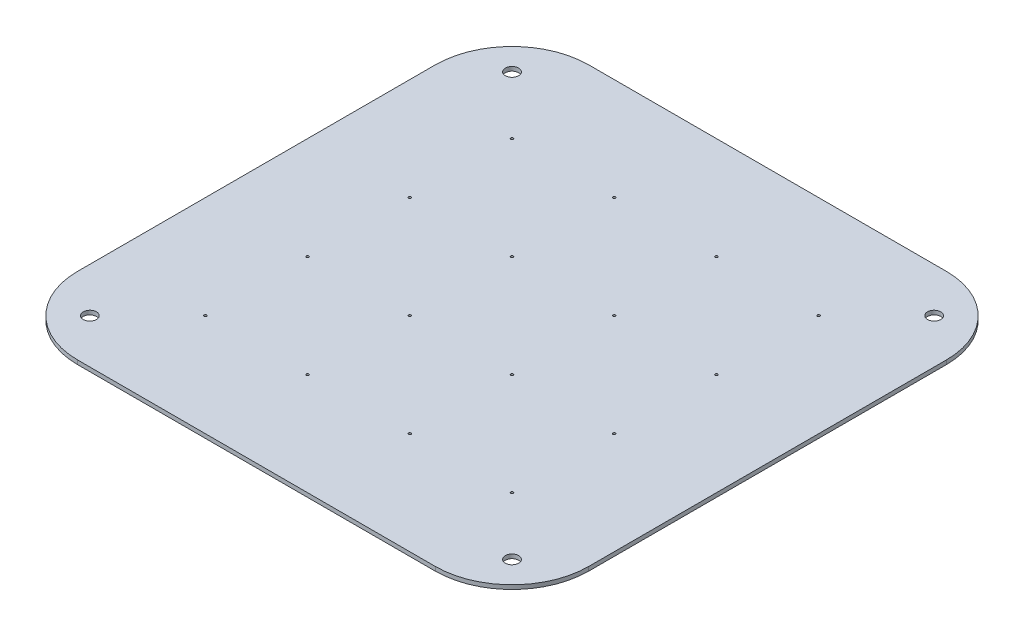
ISO-10303-21;
HEADER;
FILE_DESCRIPTION(('STEP AP214'),'2;1');
FILE_NAME('part.step','',(''),(''),'','','');
FILE_SCHEMA(('AUTOMOTIVE_DESIGN { 1 0 10303 214 1 1 1 1 }'));
ENDSEC;
DATA;
#1=APPLICATION_CONTEXT('core data for automotive mechanical design processes');
#2=APPLICATION_PROTOCOL_DEFINITION('international standard','automotive_design',2000,#1);
#3=PRODUCT_CONTEXT('',#1,'mechanical');
#4=PRODUCT('Part','Part','',(#3));
#5=PRODUCT_RELATED_PRODUCT_CATEGORY('part','',(#4));
#6=PRODUCT_DEFINITION_FORMATION('','',#4);
#7=PRODUCT_DEFINITION_CONTEXT('part definition',#1,'design');
#8=PRODUCT_DEFINITION('design','',#6,#7);
#9=PRODUCT_DEFINITION_SHAPE('','',#8);
#10=(LENGTH_UNIT() NAMED_UNIT(*) SI_UNIT(.MILLI.,.METRE.));
#11=(NAMED_UNIT(*) PLANE_ANGLE_UNIT() SI_UNIT($,.RADIAN.));
#12=(NAMED_UNIT(*) SI_UNIT($,.STERADIAN.) SOLID_ANGLE_UNIT());
#13=UNCERTAINTY_MEASURE_WITH_UNIT(LENGTH_MEASURE(1.E-05),#10,'distance_accuracy_value','');
#14=(GEOMETRIC_REPRESENTATION_CONTEXT(3) GLOBAL_UNCERTAINTY_ASSIGNED_CONTEXT((#13)) GLOBAL_UNIT_ASSIGNED_CONTEXT((#10,
#11,#12)) REPRESENTATION_CONTEXT('',''));
#15=CARTESIAN_POINT('',(0.,0.,0.));
#16=DIRECTION('',(0.,0.,1.));
#17=DIRECTION('',(1.,0.,0.));
#18=AXIS2_PLACEMENT_3D('',#15,#16,#17);
#19=CARTESIAN_POINT('',(0.,1.6,-100.));
#20=DIRECTION('',(0.,0.,1.));
#21=DIRECTION('',(1.,0.,0.));
#22=AXIS2_PLACEMENT_3D('',#19,#20,#21);
#23=PLANE('',#22);
#24=DIRECTION('',(-1.,0.,0.));
#25=VECTOR('',#24,1.);
#26=CARTESIAN_POINT('',(0.,0.,-100.));
#27=LINE('',#26,#25);
#28=CARTESIAN_POINT('',(70.,0.,-100.));
#29=VERTEX_POINT('',#28);
#30=CARTESIAN_POINT('',(-70.,0.,-100.));
#31=VERTEX_POINT('',#30);
#32=EDGE_CURVE('E195',#29,#31,#27,.T.);
#33=ORIENTED_EDGE('',*,*,#32,.T.);
#34=DIRECTION('',(0.,-1.,0.));
#35=VECTOR('',#34,1.);
#36=CARTESIAN_POINT('',(-70.,1.6,-100.));
#37=LINE('',#36,#35);
#38=CARTESIAN_POINT('',(-70.,1.6,-100.));
#39=VERTEX_POINT('',#38);
#40=EDGE_CURVE('E11',#39,#31,#37,.T.);
#41=ORIENTED_EDGE('',*,*,#40,.F.);
#42=DIRECTION('',(-1.,0.,0.));
#43=VECTOR('',#42,1.);
#44=CARTESIAN_POINT('',(0.,1.6,-100.));
#45=LINE('',#44,#43);
#46=CARTESIAN_POINT('',(70.,1.6,-100.));
#47=VERTEX_POINT('',#46);
#48=EDGE_CURVE('E288',#47,#39,#45,.T.);
#49=ORIENTED_EDGE('',*,*,#48,.F.);
#50=DIRECTION('',(0.,-1.,0.));
#51=VECTOR('',#50,1.);
#52=CARTESIAN_POINT('',(70.,1.6,-100.));
#53=LINE('',#52,#51);
#54=EDGE_CURVE('E182',#47,#29,#53,.T.);
#55=ORIENTED_EDGE('',*,*,#54,.T.);
#56=EDGE_LOOP('',(#33,#41,#49,#55));
#57=FACE_BOUND('',#56,.T.);
#58=ADVANCED_FACE('F37',(#57),#23,.F.);
#59=CARTESIAN_POINT('',(-70.,1.6,-70.));
#60=DIRECTION('',(0.,-1.,0.));
#61=DIRECTION('',(0.,0.,-1.));
#62=AXIS2_PLACEMENT_3D('',#59,#60,#61);
#63=CYLINDRICAL_SURFACE('',#62,30.);
#64=CARTESIAN_POINT('',(-70.,0.,-70.));
#65=DIRECTION('',(0.,1.,0.));
#66=DIRECTION('',(0.,0.,1.));
#67=AXIS2_PLACEMENT_3D('',#64,#65,#66);
#68=CIRCLE('',#67,30.);
#69=CARTESIAN_POINT('',(-100.,0.,-70.));
#70=VERTEX_POINT('',#69);
#71=EDGE_CURVE('E198',#31,#70,#68,.T.);
#72=ORIENTED_EDGE('',*,*,#71,.T.);
#73=DIRECTION('',(0.,-1.,0.));
#74=VECTOR('',#73,1.);
#75=CARTESIAN_POINT('',(-100.,1.6,-70.));
#76=LINE('',#75,#74);
#77=CARTESIAN_POINT('',(-100.,1.6,-70.));
#78=VERTEX_POINT('',#77);
#79=EDGE_CURVE('E46',#78,#70,#76,.T.);
#80=ORIENTED_EDGE('',*,*,#79,.F.);
#81=CARTESIAN_POINT('',(-70.,1.6,-70.));
#82=DIRECTION('',(0.,1.,0.));
#83=DIRECTION('',(0.,0.,1.));
#84=AXIS2_PLACEMENT_3D('',#81,#82,#83);
#85=CIRCLE('',#84,30.);
#86=EDGE_CURVE('E97',#39,#78,#85,.T.);
#87=ORIENTED_EDGE('',*,*,#86,.F.);
#88=ORIENTED_EDGE('',*,*,#40,.T.);
#89=EDGE_LOOP('',(#72,#80,#87,#88));
#90=FACE_BOUND('',#89,.T.);
#91=ADVANCED_FACE('F274',(#90),#63,.T.);
#92=CARTESIAN_POINT('',(-100.,1.6,0.));
#93=DIRECTION('',(-1.,0.,0.));
#94=DIRECTION('',(0.,0.,1.));
#95=AXIS2_PLACEMENT_3D('',#92,#93,#94);
#96=PLANE('',#95);
#97=DIRECTION('',(0.,0.,-1.));
#98=VECTOR('',#97,1.);
#99=CARTESIAN_POINT('',(-100.,0.,0.));
#100=LINE('',#99,#98);
#101=CARTESIAN_POINT('',(-100.,0.,70.));
#102=VERTEX_POINT('',#101);
#103=EDGE_CURVE('E201',#102,#70,#100,.T.);
#104=ORIENTED_EDGE('',*,*,#103,.F.);
#105=DIRECTION('',(0.,-1.,0.));
#106=VECTOR('',#105,1.);
#107=CARTESIAN_POINT('',(-100.,1.6,70.));
#108=LINE('',#107,#106);
#109=CARTESIAN_POINT('',(-100.,1.6,70.));
#110=VERTEX_POINT('',#109);
#111=EDGE_CURVE('E267',#110,#102,#108,.T.);
#112=ORIENTED_EDGE('',*,*,#111,.F.);
#113=DIRECTION('',(0.,0.,-1.));
#114=VECTOR('',#113,1.);
#115=CARTESIAN_POINT('',(-100.,1.6,0.));
#116=LINE('',#115,#114);
#117=EDGE_CURVE('E273',#110,#78,#116,.T.);
#118=ORIENTED_EDGE('',*,*,#117,.T.);
#119=ORIENTED_EDGE('',*,*,#79,.T.);
#120=EDGE_LOOP('',(#104,#112,#118,#119));
#121=FACE_BOUND('',#120,.T.);
#122=ADVANCED_FACE('F271',(#121),#96,.T.);
#123=CARTESIAN_POINT('',(-70.,1.6,70.));
#124=DIRECTION('',(0.,-1.,0.));
#125=DIRECTION('',(0.,0.,-1.));
#126=AXIS2_PLACEMENT_3D('',#123,#124,#125);
#127=CYLINDRICAL_SURFACE('',#126,30.);
#128=CARTESIAN_POINT('',(-70.,0.,70.));
#129=DIRECTION('',(0.,1.,0.));
#130=DIRECTION('',(0.,0.,1.));
#131=AXIS2_PLACEMENT_3D('',#128,#129,#130);
#132=CIRCLE('',#131,30.);
#133=CARTESIAN_POINT('',(-70.,0.,100.));
#134=VERTEX_POINT('',#133);
#135=EDGE_CURVE('E204',#134,#102,#132,.F.);
#136=ORIENTED_EDGE('',*,*,#135,.F.);
#137=DIRECTION('',(0.,-1.,0.));
#138=VECTOR('',#137,1.);
#139=CARTESIAN_POINT('',(-70.,1.6,100.));
#140=LINE('',#139,#138);
#141=CARTESIAN_POINT('',(-70.,1.6,100.));
#142=VERTEX_POINT('',#141);
#143=EDGE_CURVE('E265',#142,#134,#140,.T.);
#144=ORIENTED_EDGE('',*,*,#143,.F.);
#145=CARTESIAN_POINT('',(-70.,1.6,70.));
#146=DIRECTION('',(0.,1.,0.));
#147=DIRECTION('',(0.,0.,1.));
#148=AXIS2_PLACEMENT_3D('',#145,#146,#147);
#149=CIRCLE('',#148,30.);
#150=EDGE_CURVE('E285',#142,#110,#149,.F.);
#151=ORIENTED_EDGE('',*,*,#150,.T.);
#152=ORIENTED_EDGE('',*,*,#111,.T.);
#153=EDGE_LOOP('',(#136,#144,#151,#152));
#154=FACE_BOUND('',#153,.T.);
#155=ADVANCED_FACE('F283',(#154),#127,.T.);
#156=CARTESIAN_POINT('',(0.,1.6,100.));
#157=DIRECTION('',(0.,0.,1.));
#158=DIRECTION('',(1.,0.,0.));
#159=AXIS2_PLACEMENT_3D('',#156,#157,#158);
#160=PLANE('',#159);
#161=DIRECTION('',(-1.,0.,0.));
#162=VECTOR('',#161,1.);
#163=CARTESIAN_POINT('',(0.,0.,100.));
#164=LINE('',#163,#162);
#165=CARTESIAN_POINT('',(70.,0.,100.));
#166=VERTEX_POINT('',#165);
#167=EDGE_CURVE('E207',#166,#134,#164,.T.);
#168=ORIENTED_EDGE('',*,*,#167,.F.);
#169=DIRECTION('',(0.,-1.,0.));
#170=VECTOR('',#169,1.);
#171=CARTESIAN_POINT('',(70.,1.6,100.));
#172=LINE('',#171,#170);
#173=CARTESIAN_POINT('',(70.,1.6,100.));
#174=VERTEX_POINT('',#173);
#175=EDGE_CURVE('E126',#174,#166,#172,.T.);
#176=ORIENTED_EDGE('',*,*,#175,.F.);
#177=DIRECTION('',(-1.,0.,0.));
#178=VECTOR('',#177,1.);
#179=CARTESIAN_POINT('',(0.,1.6,100.));
#180=LINE('',#179,#178);
#181=EDGE_CURVE('E119',#174,#142,#180,.T.);
#182=ORIENTED_EDGE('',*,*,#181,.T.);
#183=ORIENTED_EDGE('',*,*,#143,.T.);
#184=EDGE_LOOP('',(#168,#176,#182,#183));
#185=FACE_BOUND('',#184,.T.);
#186=ADVANCED_FACE('F292',(#185),#160,.T.);
#187=CARTESIAN_POINT('',(70.,1.6,70.));
#188=DIRECTION('',(0.,-1.,0.));
#189=DIRECTION('',(0.,0.,-1.));
#190=AXIS2_PLACEMENT_3D('',#187,#188,#189);
#191=CYLINDRICAL_SURFACE('',#190,30.);
#192=CARTESIAN_POINT('',(70.,0.,70.));
#193=DIRECTION('',(0.,1.,0.));
#194=DIRECTION('',(0.,0.,1.));
#195=AXIS2_PLACEMENT_3D('',#192,#193,#194);
#196=CIRCLE('',#195,30.);
#197=CARTESIAN_POINT('',(100.,0.,69.9999999999999));
#198=VERTEX_POINT('',#197);
#199=EDGE_CURVE('E125',#166,#198,#196,.T.);
#200=ORIENTED_EDGE('',*,*,#199,.T.);
#201=DIRECTION('',(0.,-1.,0.));
#202=VECTOR('',#201,1.);
#203=CARTESIAN_POINT('',(100.,1.6,69.9999999999999));
#204=LINE('',#203,#202);
#205=CARTESIAN_POINT('',(100.,1.6,69.9999999999999));
#206=VERTEX_POINT('',#205);
#207=EDGE_CURVE('E122',#206,#198,#204,.T.);
#208=ORIENTED_EDGE('',*,*,#207,.F.);
#209=CARTESIAN_POINT('',(70.,1.6,70.));
#210=DIRECTION('',(0.,1.,0.));
#211=DIRECTION('',(0.,0.,1.));
#212=AXIS2_PLACEMENT_3D('',#209,#210,#211);
#213=CIRCLE('',#212,30.);
#214=EDGE_CURVE('E111',#174,#206,#213,.T.);
#215=ORIENTED_EDGE('',*,*,#214,.F.);
#216=ORIENTED_EDGE('',*,*,#175,.T.);
#217=EDGE_LOOP('',(#200,#208,#215,#216));
#218=FACE_BOUND('',#217,.T.);
#219=ADVANCED_FACE('F123',(#218),#191,.T.);
#220=CARTESIAN_POINT('',(100.,1.6,0.));
#221=DIRECTION('',(-1.,0.,0.));
#222=DIRECTION('',(0.,0.,1.));
#223=AXIS2_PLACEMENT_3D('',#220,#221,#222);
#224=PLANE('',#223);
#225=DIRECTION('',(0.,0.,-1.));
#226=VECTOR('',#225,1.);
#227=CARTESIAN_POINT('',(100.,0.,0.));
#228=LINE('',#227,#226);
#229=CARTESIAN_POINT('',(100.,0.,-69.9999999999999));
#230=VERTEX_POINT('',#229);
#231=EDGE_CURVE('E83',#198,#230,#228,.T.);
#232=ORIENTED_EDGE('',*,*,#231,.T.);
#233=DIRECTION('',(0.,-1.,0.));
#234=VECTOR('',#233,1.);
#235=CARTESIAN_POINT('',(100.,1.6,-69.9999999999999));
#236=LINE('',#235,#234);
#237=CARTESIAN_POINT('',(100.,1.6,-69.9999999999999));
#238=VERTEX_POINT('',#237);
#239=EDGE_CURVE('E127',#238,#230,#236,.T.);
#240=ORIENTED_EDGE('',*,*,#239,.F.);
#241=DIRECTION('',(0.,0.,-1.));
#242=VECTOR('',#241,1.);
#243=CARTESIAN_POINT('',(100.,1.6,0.));
#244=LINE('',#243,#242);
#245=EDGE_CURVE('E116',#206,#238,#244,.T.);
#246=ORIENTED_EDGE('',*,*,#245,.F.);
#247=ORIENTED_EDGE('',*,*,#207,.T.);
#248=EDGE_LOOP('',(#232,#240,#246,#247));
#249=FACE_BOUND('',#248,.T.);
#250=ADVANCED_FACE('F129',(#249),#224,.F.);
#251=CARTESIAN_POINT('',(-19.9999999999999,1.6,19.9999999999999));
#252=DIRECTION('',(0.,-1.,0.));
#253=DIRECTION('',(0.,0.,-1.));
#254=AXIS2_PLACEMENT_3D('',#251,#252,#253);
#255=CYLINDRICAL_SURFACE('',#254,0.499999999999999);
#256=CARTESIAN_POINT('',(-19.9999999999999,1.6,19.9999999999999));
#257=DIRECTION('',(0.,1.,0.));
#258=DIRECTION('',(0.,0.,1.));
#259=AXIS2_PLACEMENT_3D('',#256,#257,#258);
#260=CIRCLE('',#259,0.499999999999999);
#261=CARTESIAN_POINT('',(-19.9999999999999,1.6,20.4999999999999));
#262=VERTEX_POINT('',#261);
#263=EDGE_CURVE('E176',#262,#262,#260,.T.);
#264=ORIENTED_EDGE('',*,*,#263,.T.);
#265=EDGE_LOOP('',(#264));
#266=FACE_BOUND('',#265,.T.);
#267=CARTESIAN_POINT('',(-19.9999999999999,0.,19.9999999999999));
#268=DIRECTION('',(0.,1.,0.));
#269=DIRECTION('',(0.,0.,1.));
#270=AXIS2_PLACEMENT_3D('',#267,#268,#269);
#271=CIRCLE('',#270,0.499999999999999);
#272=CARTESIAN_POINT('',(-19.9999999999999,0.,20.4999999999999));
#273=VERTEX_POINT('',#272);
#274=EDGE_CURVE('E255',#273,#273,#271,.T.);
#275=ORIENTED_EDGE('',*,*,#274,.F.);
#276=EDGE_LOOP('',(#275));
#277=FACE_BOUND('',#276,.T.);
#278=ADVANCED_FACE('F353',(#266,#277),#255,.F.);
#279=CARTESIAN_POINT('',(60.,1.6,19.9999999999999));
#280=DIRECTION('',(0.,-1.,0.));
#281=DIRECTION('',(0.,0.,-1.));
#282=AXIS2_PLACEMENT_3D('',#279,#280,#281);
#283=CYLINDRICAL_SURFACE('',#282,0.499999999999999);
#284=CARTESIAN_POINT('',(60.,1.6,19.9999999999999));
#285=DIRECTION('',(0.,1.,0.));
#286=DIRECTION('',(0.,0.,1.));
#287=AXIS2_PLACEMENT_3D('',#284,#285,#286);
#288=CIRCLE('',#287,0.499999999999999);
#289=CARTESIAN_POINT('',(60.,1.6,20.4999999999999));
#290=VERTEX_POINT('',#289);
#291=EDGE_CURVE('E173',#290,#290,#288,.F.);
#292=ORIENTED_EDGE('',*,*,#291,.F.);
#293=EDGE_LOOP('',(#292));
#294=FACE_BOUND('',#293,.T.);
#295=CARTESIAN_POINT('',(60.,0.,19.9999999999999));
#296=DIRECTION('',(0.,1.,0.));
#297=DIRECTION('',(0.,0.,1.));
#298=AXIS2_PLACEMENT_3D('',#295,#296,#297);
#299=CIRCLE('',#298,0.499999999999999);
#300=CARTESIAN_POINT('',(60.,0.,20.4999999999999));
#301=VERTEX_POINT('',#300);
#302=EDGE_CURVE('E252',#301,#301,#299,.F.);
#303=ORIENTED_EDGE('',*,*,#302,.T.);
#304=EDGE_LOOP('',(#303));
#305=FACE_BOUND('',#304,.T.);
#306=ADVANCED_FACE('F356',(#294,#305),#283,.F.);
#307=CARTESIAN_POINT('',(20.,1.6,59.9999999999999));
#308=DIRECTION('',(0.,-1.,0.));
#309=DIRECTION('',(0.,0.,-1.));
#310=AXIS2_PLACEMENT_3D('',#307,#308,#309);
#311=CYLINDRICAL_SURFACE('',#310,0.499999999999999);
#312=CARTESIAN_POINT('',(20.,1.6,59.9999999999999));
#313=DIRECTION('',(0.,1.,0.));
#314=DIRECTION('',(0.,0.,1.));
#315=AXIS2_PLACEMENT_3D('',#312,#313,#314);
#316=CIRCLE('',#315,0.499999999999999);
#317=CARTESIAN_POINT('',(20.,1.6,60.4999999999999));
#318=VERTEX_POINT('',#317);
#319=EDGE_CURVE('E170',#318,#318,#316,.T.);
#320=ORIENTED_EDGE('',*,*,#319,.T.);
#321=EDGE_LOOP('',(#320));
#322=FACE_BOUND('',#321,.T.);
#323=CARTESIAN_POINT('',(20.,0.,59.9999999999999));
#324=DIRECTION('',(0.,1.,0.));
#325=DIRECTION('',(0.,0.,1.));
#326=AXIS2_PLACEMENT_3D('',#323,#324,#325);
#327=CIRCLE('',#326,0.499999999999999);
#328=CARTESIAN_POINT('',(20.,0.,60.4999999999999));
#329=VERTEX_POINT('',#328);
#330=EDGE_CURVE('E249',#329,#329,#327,.T.);
#331=ORIENTED_EDGE('',*,*,#330,.F.);
#332=EDGE_LOOP('',(#331));
#333=FACE_BOUND('',#332,.T.);
#334=ADVANCED_FACE('F360',(#322,#333),#311,.F.);
#335=CARTESIAN_POINT('',(-60.,1.6,60.));
#336=DIRECTION('',(0.,-1.,0.));
#337=DIRECTION('',(0.,0.,-1.));
#338=AXIS2_PLACEMENT_3D('',#335,#336,#337);
#339=CYLINDRICAL_SURFACE('',#338,0.499999999999999);
#340=CARTESIAN_POINT('',(-60.,1.6,60.));
#341=DIRECTION('',(0.,1.,0.));
#342=DIRECTION('',(0.,0.,1.));
#343=AXIS2_PLACEMENT_3D('',#340,#341,#342);
#344=CIRCLE('',#343,0.499999999999999);
#345=CARTESIAN_POINT('',(-60.,1.6,60.5));
#346=VERTEX_POINT('',#345);
#347=EDGE_CURVE('E167',#346,#346,#344,.F.);
#348=ORIENTED_EDGE('',*,*,#347,.F.);
#349=EDGE_LOOP('',(#348));
#350=FACE_BOUND('',#349,.T.);
#351=CARTESIAN_POINT('',(-60.,0.,60.));
#352=DIRECTION('',(0.,1.,0.));
#353=DIRECTION('',(0.,0.,1.));
#354=AXIS2_PLACEMENT_3D('',#351,#352,#353);
#355=CIRCLE('',#354,0.499999999999999);
#356=CARTESIAN_POINT('',(-60.,0.,60.5));
#357=VERTEX_POINT('',#356);
#358=EDGE_CURVE('E246',#357,#357,#355,.F.);
#359=ORIENTED_EDGE('',*,*,#358,.T.);
#360=EDGE_LOOP('',(#359));
#361=FACE_BOUND('',#360,.T.);
#362=ADVANCED_FACE('F364',(#350,#361),#339,.F.);
#363=CARTESIAN_POINT('',(19.9999999999999,1.6,-19.9999999999999));
#364=DIRECTION('',(0.,-1.,0.));
#365=DIRECTION('',(0.,0.,-1.));
#366=AXIS2_PLACEMENT_3D('',#363,#364,#365);
#367=CYLINDRICAL_SURFACE('',#366,0.499999999999999);
#368=CARTESIAN_POINT('',(19.9999999999999,1.6,-19.9999999999999));
#369=DIRECTION('',(0.,1.,0.));
#370=DIRECTION('',(0.,0.,1.));
#371=AXIS2_PLACEMENT_3D('',#368,#369,#370);
#372=CIRCLE('',#371,0.499999999999999);
#373=CARTESIAN_POINT('',(19.9999999999999,1.6,-19.4999999999999));
#374=VERTEX_POINT('',#373);
#375=EDGE_CURVE('E164',#374,#374,#372,.T.);
#376=ORIENTED_EDGE('',*,*,#375,.T.);
#377=EDGE_LOOP('',(#376));
#378=FACE_BOUND('',#377,.T.);
#379=CARTESIAN_POINT('',(19.9999999999999,0.,-19.9999999999999));
#380=DIRECTION('',(0.,1.,0.));
#381=DIRECTION('',(0.,0.,1.));
#382=AXIS2_PLACEMENT_3D('',#379,#380,#381);
#383=CIRCLE('',#382,0.499999999999999);
#384=CARTESIAN_POINT('',(19.9999999999999,0.,-19.4999999999999));
#385=VERTEX_POINT('',#384);
#386=EDGE_CURVE('E243',#385,#385,#383,.T.);
#387=ORIENTED_EDGE('',*,*,#386,.F.);
#388=EDGE_LOOP('',(#387));
#389=FACE_BOUND('',#388,.T.);
#390=ADVANCED_FACE('F368',(#378,#389),#367,.F.);
#391=CARTESIAN_POINT('',(60.,1.6,-60.));
#392=DIRECTION('',(0.,-1.,0.));
#393=DIRECTION('',(0.,0.,-1.));
#394=AXIS2_PLACEMENT_3D('',#391,#392,#393);
#395=CYLINDRICAL_SURFACE('',#394,0.499999999999999);
#396=CARTESIAN_POINT('',(60.,1.6,-60.));
#397=DIRECTION('',(0.,1.,0.));
#398=DIRECTION('',(0.,0.,1.));
#399=AXIS2_PLACEMENT_3D('',#396,#397,#398);
#400=CIRCLE('',#399,0.499999999999999);
#401=CARTESIAN_POINT('',(60.,1.6,-59.5));
#402=VERTEX_POINT('',#401);
#403=EDGE_CURVE('E161',#402,#402,#400,.F.);
#404=ORIENTED_EDGE('',*,*,#403,.F.);
#405=EDGE_LOOP('',(#404));
#406=FACE_BOUND('',#405,.T.);
#407=CARTESIAN_POINT('',(60.,0.,-60.));
#408=DIRECTION('',(0.,1.,0.));
#409=DIRECTION('',(0.,0.,1.));
#410=AXIS2_PLACEMENT_3D('',#407,#408,#409);
#411=CIRCLE('',#410,0.499999999999999);
#412=CARTESIAN_POINT('',(60.,0.,-59.5));
#413=VERTEX_POINT('',#412);
#414=EDGE_CURVE('E240',#413,#413,#411,.F.);
#415=ORIENTED_EDGE('',*,*,#414,.T.);
#416=EDGE_LOOP('',(#415));
#417=FACE_BOUND('',#416,.T.);
#418=ADVANCED_FACE('F372',(#406,#417),#395,.F.);
#419=CARTESIAN_POINT('',(-19.9999999999999,1.6,-19.9999999999999));
#420=DIRECTION('',(0.,-1.,0.));
#421=DIRECTION('',(0.,0.,-1.));
#422=AXIS2_PLACEMENT_3D('',#419,#420,#421);
#423=CYLINDRICAL_SURFACE('',#422,0.499999999999999);
#424=CARTESIAN_POINT('',(-19.9999999999999,1.6,-19.9999999999999));
#425=DIRECTION('',(0.,1.,0.));
#426=DIRECTION('',(0.,0.,1.));
#427=AXIS2_PLACEMENT_3D('',#424,#425,#426);
#428=CIRCLE('',#427,0.499999999999999);
#429=CARTESIAN_POINT('',(-19.9999999999999,1.6,-19.4999999999999));
#430=VERTEX_POINT('',#429);
#431=EDGE_CURVE('E158',#430,#430,#428,.F.);
#432=ORIENTED_EDGE('',*,*,#431,.F.);
#433=EDGE_LOOP('',(#432));
#434=FACE_BOUND('',#433,.T.);
#435=CARTESIAN_POINT('',(-19.9999999999999,0.,-19.9999999999999));
#436=DIRECTION('',(0.,1.,0.));
#437=DIRECTION('',(0.,0.,1.));
#438=AXIS2_PLACEMENT_3D('',#435,#436,#437);
#439=CIRCLE('',#438,0.499999999999999);
#440=CARTESIAN_POINT('',(-19.9999999999999,0.,-19.4999999999999));
#441=VERTEX_POINT('',#440);
#442=EDGE_CURVE('E237',#441,#441,#439,.F.);
#443=ORIENTED_EDGE('',*,*,#442,.T.);
#444=EDGE_LOOP('',(#443));
#445=FACE_BOUND('',#444,.T.);
#446=ADVANCED_FACE('F376',(#434,#445),#423,.F.);
#447=CARTESIAN_POINT('',(-19.9999999999999,1.6,-60.));
#448=DIRECTION('',(0.,-1.,0.));
#449=DIRECTION('',(0.,0.,-1.));
#450=AXIS2_PLACEMENT_3D('',#447,#448,#449);
#451=CYLINDRICAL_SURFACE('',#450,0.499999999999999);
#452=CARTESIAN_POINT('',(-19.9999999999999,1.6,-60.));
#453=DIRECTION('',(0.,1.,0.));
#454=DIRECTION('',(0.,0.,1.));
#455=AXIS2_PLACEMENT_3D('',#452,#453,#454);
#456=CIRCLE('',#455,0.499999999999999);
#457=CARTESIAN_POINT('',(-19.9999999999999,1.6,-59.5));
#458=VERTEX_POINT('',#457);
#459=EDGE_CURVE('E155',#458,#458,#456,.T.);
#460=ORIENTED_EDGE('',*,*,#459,.T.);
#461=EDGE_LOOP('',(#460));
#462=FACE_BOUND('',#461,.T.);
#463=CARTESIAN_POINT('',(-19.9999999999999,0.,-60.));
#464=DIRECTION('',(0.,1.,0.));
#465=DIRECTION('',(0.,0.,1.));
#466=AXIS2_PLACEMENT_3D('',#463,#464,#465);
#467=CIRCLE('',#466,0.499999999999999);
#468=CARTESIAN_POINT('',(-19.9999999999999,0.,-59.5));
#469=VERTEX_POINT('',#468);
#470=EDGE_CURVE('E234',#469,#469,#467,.T.);
#471=ORIENTED_EDGE('',*,*,#470,.F.);
#472=EDGE_LOOP('',(#471));
#473=FACE_BOUND('',#472,.T.);
#474=ADVANCED_FACE('F380',(#462,#473),#451,.F.);
#475=CARTESIAN_POINT('',(-60.,1.6,-60.));
#476=DIRECTION('',(0.,-1.,0.));
#477=DIRECTION('',(0.,0.,-1.));
#478=AXIS2_PLACEMENT_3D('',#475,#476,#477);
#479=CYLINDRICAL_SURFACE('',#478,0.499999999999999);
#480=CARTESIAN_POINT('',(-60.,1.6,-60.));
#481=DIRECTION('',(0.,1.,0.));
#482=DIRECTION('',(0.,0.,1.));
#483=AXIS2_PLACEMENT_3D('',#480,#481,#482);
#484=CIRCLE('',#483,0.499999999999999);
#485=CARTESIAN_POINT('',(-60.,1.6,-59.5));
#486=VERTEX_POINT('',#485);
#487=EDGE_CURVE('E152',#486,#486,#484,.T.);
#488=ORIENTED_EDGE('',*,*,#487,.T.);
#489=EDGE_LOOP('',(#488));
#490=FACE_BOUND('',#489,.T.);
#491=CARTESIAN_POINT('',(-60.,0.,-60.));
#492=DIRECTION('',(0.,1.,0.));
#493=DIRECTION('',(0.,0.,1.));
#494=AXIS2_PLACEMENT_3D('',#491,#492,#493);
#495=CIRCLE('',#494,0.499999999999999);
#496=CARTESIAN_POINT('',(-60.,0.,-59.5));
#497=VERTEX_POINT('',#496);
#498=EDGE_CURVE('E231',#497,#497,#495,.T.);
#499=ORIENTED_EDGE('',*,*,#498,.F.);
#500=EDGE_LOOP('',(#499));
#501=FACE_BOUND('',#500,.T.);
#502=ADVANCED_FACE('F384',(#490,#501),#479,.F.);
#503=CARTESIAN_POINT('',(-60.,1.6,-19.9999999999999));
#504=DIRECTION('',(0.,-1.,0.));
#505=DIRECTION('',(0.,0.,-1.));
#506=AXIS2_PLACEMENT_3D('',#503,#504,#505);
#507=CYLINDRICAL_SURFACE('',#506,0.499999999999999);
#508=CARTESIAN_POINT('',(-60.,1.6,-19.9999999999999));
#509=DIRECTION('',(0.,1.,0.));
#510=DIRECTION('',(0.,0.,1.));
#511=AXIS2_PLACEMENT_3D('',#508,#509,#510);
#512=CIRCLE('',#511,0.499999999999999);
#513=CARTESIAN_POINT('',(-60.,1.6,-19.4999999999999));
#514=VERTEX_POINT('',#513);
#515=EDGE_CURVE('E149',#514,#514,#512,.F.);
#516=ORIENTED_EDGE('',*,*,#515,.F.);
#517=EDGE_LOOP('',(#516));
#518=FACE_BOUND('',#517,.T.);
#519=CARTESIAN_POINT('',(-60.,0.,-19.9999999999999));
#520=DIRECTION('',(0.,1.,0.));
#521=DIRECTION('',(0.,0.,1.));
#522=AXIS2_PLACEMENT_3D('',#519,#520,#521);
#523=CIRCLE('',#522,0.499999999999999);
#524=CARTESIAN_POINT('',(-60.,0.,-19.4999999999999));
#525=VERTEX_POINT('',#524);
#526=EDGE_CURVE('E228',#525,#525,#523,.F.);
#527=ORIENTED_EDGE('',*,*,#526,.T.);
#528=EDGE_LOOP('',(#527));
#529=FACE_BOUND('',#528,.T.);
#530=ADVANCED_FACE('F388',(#518,#529),#507,.F.);
#531=CARTESIAN_POINT('',(60.,1.6,-19.9999999999999));
#532=DIRECTION('',(0.,-1.,0.));
#533=DIRECTION('',(0.,0.,-1.));
#534=AXIS2_PLACEMENT_3D('',#531,#532,#533);
#535=CYLINDRICAL_SURFACE('',#534,0.499999999999999);
#536=CARTESIAN_POINT('',(60.,1.6,-19.9999999999999));
#537=DIRECTION('',(0.,1.,0.));
#538=DIRECTION('',(0.,0.,1.));
#539=AXIS2_PLACEMENT_3D('',#536,#537,#538);
#540=CIRCLE('',#539,0.499999999999999);
#541=CARTESIAN_POINT('',(60.,1.6,-19.4999999999999));
#542=VERTEX_POINT('',#541);
#543=EDGE_CURVE('E146',#542,#542,#540,.T.);
#544=ORIENTED_EDGE('',*,*,#543,.T.);
#545=EDGE_LOOP('',(#544));
#546=FACE_BOUND('',#545,.T.);
#547=CARTESIAN_POINT('',(60.,0.,-19.9999999999999));
#548=DIRECTION('',(0.,1.,0.));
#549=DIRECTION('',(0.,0.,1.));
#550=AXIS2_PLACEMENT_3D('',#547,#548,#549);
#551=CIRCLE('',#550,0.499999999999999);
#552=CARTESIAN_POINT('',(60.,0.,-19.4999999999999));
#553=VERTEX_POINT('',#552);
#554=EDGE_CURVE('E225',#553,#553,#551,.T.);
#555=ORIENTED_EDGE('',*,*,#554,.F.);
#556=EDGE_LOOP('',(#555));
#557=FACE_BOUND('',#556,.T.);
#558=ADVANCED_FACE('F392',(#546,#557),#535,.F.);
#559=CARTESIAN_POINT('',(19.9999999999999,1.6,-60.));
#560=DIRECTION('',(0.,-1.,0.));
#561=DIRECTION('',(0.,0.,-1.));
#562=AXIS2_PLACEMENT_3D('',#559,#560,#561);
#563=CYLINDRICAL_SURFACE('',#562,0.499999999999999);
#564=CARTESIAN_POINT('',(19.9999999999999,1.6,-60.));
#565=DIRECTION('',(0.,1.,0.));
#566=DIRECTION('',(0.,0.,1.));
#567=AXIS2_PLACEMENT_3D('',#564,#565,#566);
#568=CIRCLE('',#567,0.499999999999999);
#569=CARTESIAN_POINT('',(19.9999999999999,1.6,-59.5));
#570=VERTEX_POINT('',#569);
#571=EDGE_CURVE('E143',#570,#570,#568,.F.);
#572=ORIENTED_EDGE('',*,*,#571,.F.);
#573=EDGE_LOOP('',(#572));
#574=FACE_BOUND('',#573,.T.);
#575=CARTESIAN_POINT('',(19.9999999999999,0.,-60.));
#576=DIRECTION('',(0.,1.,0.));
#577=DIRECTION('',(0.,0.,1.));
#578=AXIS2_PLACEMENT_3D('',#575,#576,#577);
#579=CIRCLE('',#578,0.499999999999999);
#580=CARTESIAN_POINT('',(19.9999999999999,0.,-59.5));
#581=VERTEX_POINT('',#580);
#582=EDGE_CURVE('E222',#581,#581,#579,.F.);
#583=ORIENTED_EDGE('',*,*,#582,.T.);
#584=EDGE_LOOP('',(#583));
#585=FACE_BOUND('',#584,.T.);
#586=ADVANCED_FACE('F396',(#574,#585),#563,.F.);
#587=CARTESIAN_POINT('',(-19.9999999999999,1.6,60.));
#588=DIRECTION('',(0.,-1.,0.));
#589=DIRECTION('',(0.,0.,-1.));
#590=AXIS2_PLACEMENT_3D('',#587,#588,#589);
#591=CYLINDRICAL_SURFACE('',#590,0.499999999999999);
#592=CARTESIAN_POINT('',(-19.9999999999999,1.6,60.));
#593=DIRECTION('',(0.,1.,0.));
#594=DIRECTION('',(0.,0.,1.));
#595=AXIS2_PLACEMENT_3D('',#592,#593,#594);
#596=CIRCLE('',#595,0.499999999999999);
#597=CARTESIAN_POINT('',(-19.9999999999999,1.6,60.5));
#598=VERTEX_POINT('',#597);
#599=EDGE_CURVE('E140',#598,#598,#596,.F.);
#600=ORIENTED_EDGE('',*,*,#599,.F.);
#601=EDGE_LOOP('',(#600));
#602=FACE_BOUND('',#601,.T.);
#603=CARTESIAN_POINT('',(-19.9999999999999,0.,60.));
#604=DIRECTION('',(0.,1.,0.));
#605=DIRECTION('',(0.,0.,1.));
#606=AXIS2_PLACEMENT_3D('',#603,#604,#605);
#607=CIRCLE('',#606,0.499999999999999);
#608=CARTESIAN_POINT('',(-19.9999999999999,0.,60.5));
#609=VERTEX_POINT('',#608);
#610=EDGE_CURVE('E219',#609,#609,#607,.F.);
#611=ORIENTED_EDGE('',*,*,#610,.T.);
#612=EDGE_LOOP('',(#611));
#613=FACE_BOUND('',#612,.T.);
#614=ADVANCED_FACE('F400',(#602,#613),#591,.F.);
#615=CARTESIAN_POINT('',(60.,1.6,59.9999999999999));
#616=DIRECTION('',(0.,-1.,0.));
#617=DIRECTION('',(0.,0.,-1.));
#618=AXIS2_PLACEMENT_3D('',#615,#616,#617);
#619=CYLINDRICAL_SURFACE('',#618,0.499999999999999);
#620=CARTESIAN_POINT('',(60.,1.6,59.9999999999999));
#621=DIRECTION('',(0.,1.,0.));
#622=DIRECTION('',(0.,0.,1.));
#623=AXIS2_PLACEMENT_3D('',#620,#621,#622);
#624=CIRCLE('',#623,0.499999999999999);
#625=CARTESIAN_POINT('',(60.,1.6,60.4999999999999));
#626=VERTEX_POINT('',#625);
#627=EDGE_CURVE('E137',#626,#626,#624,.T.);
#628=ORIENTED_EDGE('',*,*,#627,.T.);
#629=EDGE_LOOP('',(#628));
#630=FACE_BOUND('',#629,.T.);
#631=CARTESIAN_POINT('',(60.,0.,59.9999999999999));
#632=DIRECTION('',(0.,1.,0.));
#633=DIRECTION('',(0.,0.,1.));
#634=AXIS2_PLACEMENT_3D('',#631,#632,#633);
#635=CIRCLE('',#634,0.499999999999999);
#636=CARTESIAN_POINT('',(60.,0.,60.4999999999999));
#637=VERTEX_POINT('',#636);
#638=EDGE_CURVE('E216',#637,#637,#635,.T.);
#639=ORIENTED_EDGE('',*,*,#638,.F.);
#640=EDGE_LOOP('',(#639));
#641=FACE_BOUND('',#640,.T.);
#642=ADVANCED_FACE('F307',(#630,#641),#619,.F.);
#643=CARTESIAN_POINT('',(19.9999999999999,1.6,19.9999999999999));
#644=DIRECTION('',(0.,-1.,0.));
#645=DIRECTION('',(0.,0.,-1.));
#646=AXIS2_PLACEMENT_3D('',#643,#644,#645);
#647=CYLINDRICAL_SURFACE('',#646,0.499999999999999);
#648=CARTESIAN_POINT('',(19.9999999999999,1.6,19.9999999999999));
#649=DIRECTION('',(0.,1.,0.));
#650=DIRECTION('',(0.,0.,1.));
#651=AXIS2_PLACEMENT_3D('',#648,#649,#650);
#652=CIRCLE('',#651,0.499999999999999);
#653=CARTESIAN_POINT('',(19.9999999999999,1.6,20.4999999999999));
#654=VERTEX_POINT('',#653);
#655=EDGE_CURVE('E131',#654,#654,#652,.F.);
#656=ORIENTED_EDGE('',*,*,#655,.F.);
#657=EDGE_LOOP('',(#656));
#658=FACE_BOUND('',#657,.T.);
#659=CARTESIAN_POINT('',(19.9999999999999,0.,19.9999999999999));
#660=DIRECTION('',(0.,1.,0.));
#661=DIRECTION('',(0.,0.,1.));
#662=AXIS2_PLACEMENT_3D('',#659,#660,#661);
#663=CIRCLE('',#662,0.499999999999999);
#664=CARTESIAN_POINT('',(19.9999999999999,0.,20.4999999999999));
#665=VERTEX_POINT('',#664);
#666=EDGE_CURVE('E213',#665,#665,#663,.F.);
#667=ORIENTED_EDGE('',*,*,#666,.T.);
#668=EDGE_LOOP('',(#667));
#669=FACE_BOUND('',#668,.T.);
#670=ADVANCED_FACE('F298',(#658,#669),#647,.F.);
#671=CARTESIAN_POINT('',(70.,1.6,-70.));
#672=DIRECTION('',(0.,-1.,0.));
#673=DIRECTION('',(0.,0.,-1.));
#674=AXIS2_PLACEMENT_3D('',#671,#672,#673);
#675=CYLINDRICAL_SURFACE('',#674,30.);
#676=CARTESIAN_POINT('',(70.,0.,-70.));
#677=DIRECTION('',(0.,1.,0.));
#678=DIRECTION('',(0.,0.,1.));
#679=AXIS2_PLACEMENT_3D('',#676,#677,#678);
#680=CIRCLE('',#679,30.);
#681=EDGE_CURVE('E89',#230,#29,#680,.T.);
#682=ORIENTED_EDGE('',*,*,#681,.T.);
#683=ORIENTED_EDGE('',*,*,#54,.F.);
#684=CARTESIAN_POINT('',(70.,1.6,-70.));
#685=DIRECTION('',(0.,1.,0.));
#686=DIRECTION('',(0.,0.,1.));
#687=AXIS2_PLACEMENT_3D('',#684,#685,#686);
#688=CIRCLE('',#687,30.);
#689=EDGE_CURVE('E54',#238,#47,#688,.T.);
#690=ORIENTED_EDGE('',*,*,#689,.F.);
#691=ORIENTED_EDGE('',*,*,#239,.T.);
#692=EDGE_LOOP('',(#682,#683,#690,#691));
#693=FACE_BOUND('',#692,.T.);
#694=ADVANCED_FACE('F295',(#693),#675,.T.);
#695=CARTESIAN_POINT('',(-82.6,1.6,-82.6));
#696=DIRECTION('',(0.,-1.,0.));
#697=DIRECTION('',(0.,0.,-1.));
#698=AXIS2_PLACEMENT_3D('',#695,#696,#697);
#699=CYLINDRICAL_SURFACE('',#698,2.6);
#700=CARTESIAN_POINT('',(-82.6,1.6,-82.6));
#701=DIRECTION('',(0.,1.,0.));
#702=DIRECTION('',(0.,0.,1.));
#703=AXIS2_PLACEMENT_3D('',#700,#701,#702);
#704=CIRCLE('',#703,2.6);
#705=CARTESIAN_POINT('',(-82.6,1.6,-80.));
#706=VERTEX_POINT('',#705);
#707=EDGE_CURVE('E789',#706,#706,#704,.T.);
#708=ORIENTED_EDGE('',*,*,#707,.T.);
#709=EDGE_LOOP('',(#708));
#710=FACE_BOUND('',#709,.T.);
#711=CARTESIAN_POINT('',(-82.6,0.,-82.6));
#712=DIRECTION('',(0.,1.,0.));
#713=DIRECTION('',(0.,0.,1.));
#714=AXIS2_PLACEMENT_3D('',#711,#712,#713);
#715=CIRCLE('',#714,2.6);
#716=CARTESIAN_POINT('',(-82.6,0.,-80.));
#717=VERTEX_POINT('',#716);
#718=EDGE_CURVE('E192',#717,#717,#715,.T.);
#719=ORIENTED_EDGE('',*,*,#718,.F.);
#720=EDGE_LOOP('',(#719));
#721=FACE_BOUND('',#720,.T.);
#722=ADVANCED_FACE('F297',(#710,#721),#699,.F.);
#723=CARTESIAN_POINT('',(82.6,1.6,-82.6));
#724=DIRECTION('',(0.,-1.,0.));
#725=DIRECTION('',(0.,0.,-1.));
#726=AXIS2_PLACEMENT_3D('',#723,#724,#725);
#727=CYLINDRICAL_SURFACE('',#726,2.6);
#728=CARTESIAN_POINT('',(82.6,1.6,-82.6));
#729=DIRECTION('',(0.,1.,0.));
#730=DIRECTION('',(0.,0.,1.));
#731=AXIS2_PLACEMENT_3D('',#728,#729,#730);
#732=CIRCLE('',#731,2.6);
#733=CARTESIAN_POINT('',(82.6,1.6,-80.));
#734=VERTEX_POINT('',#733);
#735=EDGE_CURVE('E786',#734,#734,#732,.T.);
#736=ORIENTED_EDGE('',*,*,#735,.T.);
#737=EDGE_LOOP('',(#736));
#738=FACE_BOUND('',#737,.T.);
#739=CARTESIAN_POINT('',(82.6,0.,-82.6));
#740=DIRECTION('',(0.,1.,0.));
#741=DIRECTION('',(0.,0.,1.));
#742=AXIS2_PLACEMENT_3D('',#739,#740,#741);
#743=CIRCLE('',#742,2.6);
#744=CARTESIAN_POINT('',(82.6,0.,-80.));
#745=VERTEX_POINT('',#744);
#746=EDGE_CURVE('E189',#745,#745,#743,.T.);
#747=ORIENTED_EDGE('',*,*,#746,.F.);
#748=EDGE_LOOP('',(#747));
#749=FACE_BOUND('',#748,.T.);
#750=ADVANCED_FACE('F304',(#738,#749),#727,.F.);
#751=CARTESIAN_POINT('',(82.6,1.6,82.6));
#752=DIRECTION('',(0.,-1.,0.));
#753=DIRECTION('',(0.,0.,-1.));
#754=AXIS2_PLACEMENT_3D('',#751,#752,#753);
#755=CYLINDRICAL_SURFACE('',#754,2.6);
#756=CARTESIAN_POINT('',(82.6,1.6,82.6));
#757=DIRECTION('',(0.,1.,0.));
#758=DIRECTION('',(0.,0.,1.));
#759=AXIS2_PLACEMENT_3D('',#756,#757,#758);
#760=CIRCLE('',#759,2.6);
#761=CARTESIAN_POINT('',(82.6,1.6,85.2));
#762=VERTEX_POINT('',#761);
#763=EDGE_CURVE('E332',#762,#762,#760,.T.);
#764=ORIENTED_EDGE('',*,*,#763,.T.);
#765=EDGE_LOOP('',(#764));
#766=FACE_BOUND('',#765,.T.);
#767=CARTESIAN_POINT('',(82.6,0.,82.6));
#768=DIRECTION('',(0.,1.,0.));
#769=DIRECTION('',(0.,0.,1.));
#770=AXIS2_PLACEMENT_3D('',#767,#768,#769);
#771=CIRCLE('',#770,2.6);
#772=CARTESIAN_POINT('',(82.6,0.,85.2));
#773=VERTEX_POINT('',#772);
#774=EDGE_CURVE('E186',#773,#773,#771,.T.);
#775=ORIENTED_EDGE('',*,*,#774,.F.);
#776=EDGE_LOOP('',(#775));
#777=FACE_BOUND('',#776,.T.);
#778=ADVANCED_FACE('F320',(#766,#777),#755,.F.);
#779=CARTESIAN_POINT('',(-82.6000000000001,1.6,82.6));
#780=DIRECTION('',(0.,-1.,0.));
#781=DIRECTION('',(0.,0.,-1.));
#782=AXIS2_PLACEMENT_3D('',#779,#780,#781);
#783=CYLINDRICAL_SURFACE('',#782,2.6);
#784=CARTESIAN_POINT('',(-82.6000000000001,1.6,82.6));
#785=DIRECTION('',(0.,1.,0.));
#786=DIRECTION('',(0.,0.,1.));
#787=AXIS2_PLACEMENT_3D('',#784,#785,#786);
#788=CIRCLE('',#787,2.6);
#789=CARTESIAN_POINT('',(-82.6000000000001,1.6,85.2));
#790=VERTEX_POINT('',#789);
#791=EDGE_CURVE('E261',#790,#790,#788,.T.);
#792=ORIENTED_EDGE('',*,*,#791,.T.);
#793=EDGE_LOOP('',(#792));
#794=FACE_BOUND('',#793,.T.);
#795=CARTESIAN_POINT('',(-82.6000000000001,0.,82.6));
#796=DIRECTION('',(0.,1.,0.));
#797=DIRECTION('',(0.,0.,1.));
#798=AXIS2_PLACEMENT_3D('',#795,#796,#797);
#799=CIRCLE('',#798,2.6);
#800=CARTESIAN_POINT('',(-82.6000000000001,0.,85.2));
#801=VERTEX_POINT('',#800);
#802=EDGE_CURVE('E183',#801,#801,#799,.T.);
#803=ORIENTED_EDGE('',*,*,#802,.F.);
#804=EDGE_LOOP('',(#803));
#805=FACE_BOUND('',#804,.T.);
#806=ADVANCED_FACE('F39',(#794,#805),#783,.F.);
#807=CARTESIAN_POINT('',(-60.,1.6,19.9999999999999));
#808=DIRECTION('',(0.,-1.,0.));
#809=DIRECTION('',(0.,0.,-1.));
#810=AXIS2_PLACEMENT_3D('',#807,#808,#809);
#811=CYLINDRICAL_SURFACE('',#810,0.499999999999999);
#812=CARTESIAN_POINT('',(-60.,1.6,19.9999999999999));
#813=DIRECTION('',(0.,1.,0.));
#814=DIRECTION('',(0.,0.,1.));
#815=AXIS2_PLACEMENT_3D('',#812,#813,#814);
#816=CIRCLE('',#815,0.499999999999999);
#817=CARTESIAN_POINT('',(-60.,1.6,20.4999999999999));
#818=VERTEX_POINT('',#817);
#819=EDGE_CURVE('E179',#818,#818,#816,.T.);
#820=ORIENTED_EDGE('',*,*,#819,.T.);
#821=EDGE_LOOP('',(#820));
#822=FACE_BOUND('',#821,.T.);
#823=CARTESIAN_POINT('',(-60.,0.,19.9999999999999));
#824=DIRECTION('',(0.,1.,0.));
#825=DIRECTION('',(0.,0.,1.));
#826=AXIS2_PLACEMENT_3D('',#823,#824,#825);
#827=CIRCLE('',#826,0.499999999999999);
#828=CARTESIAN_POINT('',(-60.,0.,20.4999999999999));
#829=VERTEX_POINT('',#828);
#830=EDGE_CURVE('E258',#829,#829,#827,.T.);
#831=ORIENTED_EDGE('',*,*,#830,.F.);
#832=EDGE_LOOP('',(#831));
#833=FACE_BOUND('',#832,.T.);
#834=ADVANCED_FACE('F327',(#822,#833),#811,.F.);
#835=CARTESIAN_POINT('',(0.,1.6,0.));
#836=DIRECTION('',(0.,1.,0.));
#837=DIRECTION('',(0.,0.,1.));
#838=AXIS2_PLACEMENT_3D('',#835,#836,#837);
#839=PLANE('',#838);
#840=ORIENTED_EDGE('',*,*,#791,.F.);
#841=EDGE_LOOP('',(#840));
#842=FACE_BOUND('',#841,.T.);
#843=ORIENTED_EDGE('',*,*,#763,.F.);
#844=EDGE_LOOP('',(#843));
#845=FACE_BOUND('',#844,.T.);
#846=ORIENTED_EDGE('',*,*,#735,.F.);
#847=EDGE_LOOP('',(#846));
#848=FACE_BOUND('',#847,.T.);
#849=ORIENTED_EDGE('',*,*,#707,.F.);
#850=EDGE_LOOP('',(#849));
#851=FACE_BOUND('',#850,.T.);
#852=ORIENTED_EDGE('',*,*,#48,.T.);
#853=ORIENTED_EDGE('',*,*,#86,.T.);
#854=ORIENTED_EDGE('',*,*,#117,.F.);
#855=ORIENTED_EDGE('',*,*,#150,.F.);
#856=ORIENTED_EDGE('',*,*,#181,.F.);
#857=ORIENTED_EDGE('',*,*,#214,.T.);
#858=ORIENTED_EDGE('',*,*,#245,.T.);
#859=ORIENTED_EDGE('',*,*,#689,.T.);
#860=EDGE_LOOP('',(#852,#853,#854,#855,#856,#857,#858,#859));
#861=FACE_BOUND('',#860,.T.);
#862=ORIENTED_EDGE('',*,*,#655,.T.);
#863=EDGE_LOOP('',(#862));
#864=FACE_BOUND('',#863,.T.);
#865=ORIENTED_EDGE('',*,*,#627,.F.);
#866=EDGE_LOOP('',(#865));
#867=FACE_BOUND('',#866,.T.);
#868=ORIENTED_EDGE('',*,*,#599,.T.);
#869=EDGE_LOOP('',(#868));
#870=FACE_BOUND('',#869,.T.);
#871=ORIENTED_EDGE('',*,*,#571,.T.);
#872=EDGE_LOOP('',(#871));
#873=FACE_BOUND('',#872,.T.);
#874=ORIENTED_EDGE('',*,*,#543,.F.);
#875=EDGE_LOOP('',(#874));
#876=FACE_BOUND('',#875,.T.);
#877=ORIENTED_EDGE('',*,*,#515,.T.);
#878=EDGE_LOOP('',(#877));
#879=FACE_BOUND('',#878,.T.);
#880=ORIENTED_EDGE('',*,*,#487,.F.);
#881=EDGE_LOOP('',(#880));
#882=FACE_BOUND('',#881,.T.);
#883=ORIENTED_EDGE('',*,*,#459,.F.);
#884=EDGE_LOOP('',(#883));
#885=FACE_BOUND('',#884,.T.);
#886=ORIENTED_EDGE('',*,*,#431,.T.);
#887=EDGE_LOOP('',(#886));
#888=FACE_BOUND('',#887,.T.);
#889=ORIENTED_EDGE('',*,*,#403,.T.);
#890=EDGE_LOOP('',(#889));
#891=FACE_BOUND('',#890,.T.);
#892=ORIENTED_EDGE('',*,*,#375,.F.);
#893=EDGE_LOOP('',(#892));
#894=FACE_BOUND('',#893,.T.);
#895=ORIENTED_EDGE('',*,*,#347,.T.);
#896=EDGE_LOOP('',(#895));
#897=FACE_BOUND('',#896,.T.);
#898=ORIENTED_EDGE('',*,*,#319,.F.);
#899=EDGE_LOOP('',(#898));
#900=FACE_BOUND('',#899,.T.);
#901=ORIENTED_EDGE('',*,*,#291,.T.);
#902=EDGE_LOOP('',(#901));
#903=FACE_BOUND('',#902,.T.);
#904=ORIENTED_EDGE('',*,*,#263,.F.);
#905=EDGE_LOOP('',(#904));
#906=FACE_BOUND('',#905,.T.);
#907=ORIENTED_EDGE('',*,*,#819,.F.);
#908=EDGE_LOOP('',(#907));
#909=FACE_BOUND('',#908,.T.);
#910=ADVANCED_FACE('F113',(#842,#845,#848,#851,#861,#864,#867,#870,#873,#876,#879,#882,#885,
#888,#891,#894,#897,#900,#903,#906,#909),#839,.T.);
#911=CARTESIAN_POINT('',(0.,0.,0.));
#912=DIRECTION('',(0.,1.,0.));
#913=DIRECTION('',(0.,0.,1.));
#914=AXIS2_PLACEMENT_3D('',#911,#912,#913);
#915=PLANE('',#914);
#916=ORIENTED_EDGE('',*,*,#802,.T.);
#917=EDGE_LOOP('',(#916));
#918=FACE_BOUND('',#917,.T.);
#919=ORIENTED_EDGE('',*,*,#774,.T.);
#920=EDGE_LOOP('',(#919));
#921=FACE_BOUND('',#920,.T.);
#922=ORIENTED_EDGE('',*,*,#746,.T.);
#923=EDGE_LOOP('',(#922));
#924=FACE_BOUND('',#923,.T.);
#925=ORIENTED_EDGE('',*,*,#718,.T.);
#926=EDGE_LOOP('',(#925));
#927=FACE_BOUND('',#926,.T.);
#928=ORIENTED_EDGE('',*,*,#32,.F.);
#929=ORIENTED_EDGE('',*,*,#681,.F.);
#930=ORIENTED_EDGE('',*,*,#231,.F.);
#931=ORIENTED_EDGE('',*,*,#199,.F.);
#932=ORIENTED_EDGE('',*,*,#167,.T.);
#933=ORIENTED_EDGE('',*,*,#135,.T.);
#934=ORIENTED_EDGE('',*,*,#103,.T.);
#935=ORIENTED_EDGE('',*,*,#71,.F.);
#936=EDGE_LOOP('',(#928,#929,#930,#931,#932,#933,#934,#935));
#937=FACE_BOUND('',#936,.T.);
#938=ORIENTED_EDGE('',*,*,#666,.F.);
#939=EDGE_LOOP('',(#938));
#940=FACE_BOUND('',#939,.T.);
#941=ORIENTED_EDGE('',*,*,#638,.T.);
#942=EDGE_LOOP('',(#941));
#943=FACE_BOUND('',#942,.T.);
#944=ORIENTED_EDGE('',*,*,#610,.F.);
#945=EDGE_LOOP('',(#944));
#946=FACE_BOUND('',#945,.T.);
#947=ORIENTED_EDGE('',*,*,#582,.F.);
#948=EDGE_LOOP('',(#947));
#949=FACE_BOUND('',#948,.T.);
#950=ORIENTED_EDGE('',*,*,#554,.T.);
#951=EDGE_LOOP('',(#950));
#952=FACE_BOUND('',#951,.T.);
#953=ORIENTED_EDGE('',*,*,#526,.F.);
#954=EDGE_LOOP('',(#953));
#955=FACE_BOUND('',#954,.T.);
#956=ORIENTED_EDGE('',*,*,#498,.T.);
#957=EDGE_LOOP('',(#956));
#958=FACE_BOUND('',#957,.T.);
#959=ORIENTED_EDGE('',*,*,#470,.T.);
#960=EDGE_LOOP('',(#959));
#961=FACE_BOUND('',#960,.T.);
#962=ORIENTED_EDGE('',*,*,#442,.F.);
#963=EDGE_LOOP('',(#962));
#964=FACE_BOUND('',#963,.T.);
#965=ORIENTED_EDGE('',*,*,#414,.F.);
#966=EDGE_LOOP('',(#965));
#967=FACE_BOUND('',#966,.T.);
#968=ORIENTED_EDGE('',*,*,#386,.T.);
#969=EDGE_LOOP('',(#968));
#970=FACE_BOUND('',#969,.T.);
#971=ORIENTED_EDGE('',*,*,#358,.F.);
#972=EDGE_LOOP('',(#971));
#973=FACE_BOUND('',#972,.T.);
#974=ORIENTED_EDGE('',*,*,#330,.T.);
#975=EDGE_LOOP('',(#974));
#976=FACE_BOUND('',#975,.T.);
#977=ORIENTED_EDGE('',*,*,#302,.F.);
#978=EDGE_LOOP('',(#977));
#979=FACE_BOUND('',#978,.T.);
#980=ORIENTED_EDGE('',*,*,#274,.T.);
#981=EDGE_LOOP('',(#980));
#982=FACE_BOUND('',#981,.T.);
#983=ORIENTED_EDGE('',*,*,#830,.T.);
#984=EDGE_LOOP('',(#983));
#985=FACE_BOUND('',#984,.T.);
#986=ADVANCED_FACE('F278',(#918,#921,#924,#927,#937,#940,#943,#946,#949,#952,#955,#958,#961,
#964,#967,#970,#973,#976,#979,#982,#985),#915,.F.);
#987=CLOSED_SHELL('',(#58,#91,#122,#155,#186,#219,#250,#278,#306,#334,#362,#390,#418,#446,#474,
#502,#530,#558,#586,#614,#642,#670,#694,#722,#750,#778,#806,#834,#910,#986));
#988=MANIFOLD_SOLID_BREP('B2',#987);
#989=ADVANCED_BREP_SHAPE_REPRESENTATION('',(#18,#988),#14);
#990=SHAPE_DEFINITION_REPRESENTATION(#9,#989);
ENDSEC;
END-ISO-10303-21;
